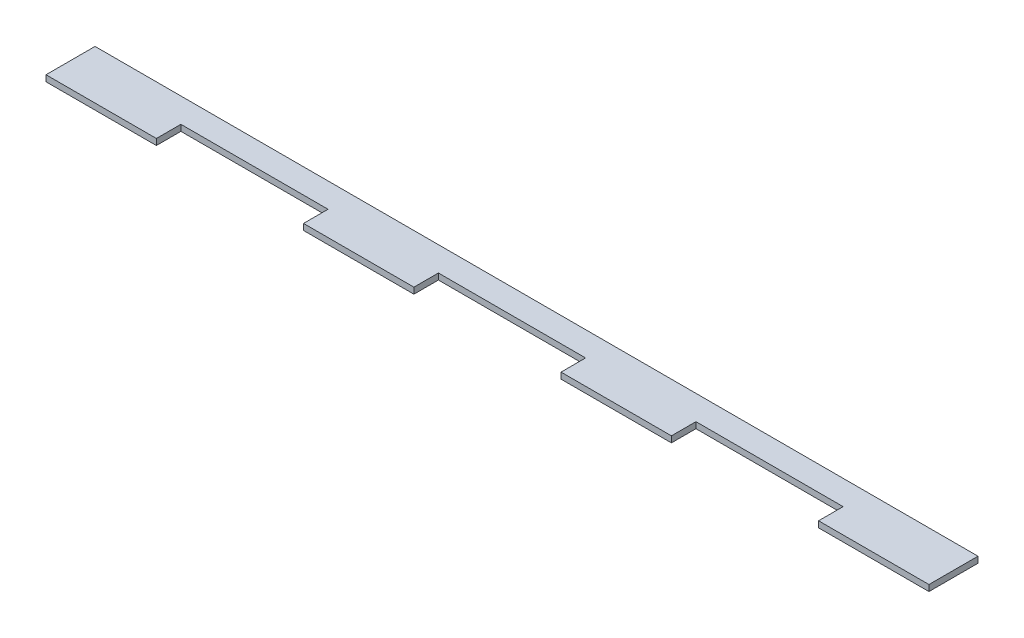
ISO-10303-21;
HEADER;
FILE_DESCRIPTION(('STEP AP214'),'2;1');
FILE_NAME('part.step','',(''),(''),'','','');
FILE_SCHEMA(('AUTOMOTIVE_DESIGN { 1 0 10303 214 1 1 1 1 }'));
ENDSEC;
DATA;
#1=APPLICATION_CONTEXT('core data for automotive mechanical design processes');
#2=APPLICATION_PROTOCOL_DEFINITION('international standard','automotive_design',2000,#1);
#3=PRODUCT_CONTEXT('',#1,'mechanical');
#4=PRODUCT('Part','Part','',(#3));
#5=PRODUCT_RELATED_PRODUCT_CATEGORY('part','',(#4));
#6=PRODUCT_DEFINITION_FORMATION('','',#4);
#7=PRODUCT_DEFINITION_CONTEXT('part definition',#1,'design');
#8=PRODUCT_DEFINITION('design','',#6,#7);
#9=PRODUCT_DEFINITION_SHAPE('','',#8);
#10=(LENGTH_UNIT() NAMED_UNIT(*) SI_UNIT(.MILLI.,.METRE.));
#11=(NAMED_UNIT(*) PLANE_ANGLE_UNIT() SI_UNIT($,.RADIAN.));
#12=(NAMED_UNIT(*) SI_UNIT($,.STERADIAN.) SOLID_ANGLE_UNIT());
#13=UNCERTAINTY_MEASURE_WITH_UNIT(LENGTH_MEASURE(1.E-05),#10,'distance_accuracy_value','');
#14=(GEOMETRIC_REPRESENTATION_CONTEXT(3) GLOBAL_UNCERTAINTY_ASSIGNED_CONTEXT((#13)) GLOBAL_UNIT_ASSIGNED_CONTEXT((#10,
#11,#12)) REPRESENTATION_CONTEXT('',''));
#15=CARTESIAN_POINT('',(0.,0.,0.));
#16=DIRECTION('',(0.,0.,1.));
#17=DIRECTION('',(1.,0.,0.));
#18=AXIS2_PLACEMENT_3D('',#15,#16,#17);
#19=CARTESIAN_POINT('',(-39.5347936844725,12.7,33.6916009072077));
#20=DIRECTION('',(0.,0.,-1.));
#21=DIRECTION('',(-1.,0.,0.));
#22=AXIS2_PLACEMENT_3D('',#19,#20,#21);
#23=PLANE('',#22);
#24=DIRECTION('',(1.,0.,0.));
#25=VECTOR('',#24,1.);
#26=CARTESIAN_POINT('',(-39.5347936844725,0.,33.6916009072077));
#27=LINE('',#26,#25);
#28=CARTESIAN_POINT('',(-39.5347936844725,0.,33.6916009072077));
#29=VERTEX_POINT('',#28);
#30=CARTESIAN_POINT('',(189.065206315528,0.,33.6916009072077));
#31=VERTEX_POINT('',#30);
#32=EDGE_CURVE('E173',#29,#31,#27,.T.);
#33=ORIENTED_EDGE('',*,*,#32,.T.);
#34=DIRECTION('',(0.,1.,0.));
#35=VECTOR('',#34,1.);
#36=CARTESIAN_POINT('',(189.065206315528,0.,33.6916009072077));
#37=LINE('',#36,#35);
#38=CARTESIAN_POINT('',(189.065206315528,12.7,33.6916009072077));
#39=VERTEX_POINT('',#38);
#40=EDGE_CURVE('E292',#31,#39,#37,.T.);
#41=ORIENTED_EDGE('',*,*,#40,.T.);
#42=DIRECTION('',(1.,0.,0.));
#43=VECTOR('',#42,1.);
#44=CARTESIAN_POINT('',(-39.5347936844725,12.7,33.6916009072077));
#45=LINE('',#44,#43);
#46=CARTESIAN_POINT('',(-39.5347936844725,12.7,33.6916009072077));
#47=VERTEX_POINT('',#46);
#48=EDGE_CURVE('E223',#47,#39,#45,.T.);
#49=ORIENTED_EDGE('',*,*,#48,.F.);
#50=DIRECTION('',(0.,-1.,0.));
#51=VECTOR('',#50,1.);
#52=CARTESIAN_POINT('',(-39.5347936844725,12.7,33.6916009072077));
#53=LINE('',#52,#51);
#54=EDGE_CURVE('E11',#47,#29,#53,.T.);
#55=ORIENTED_EDGE('',*,*,#54,.T.);
#56=EDGE_LOOP('',(#33,#41,#49,#55));
#57=FACE_BOUND('',#56,.T.);
#58=ADVANCED_FACE('F35',(#57),#23,.F.);
#59=CARTESIAN_POINT('',(1027.26520631553,0.,33.6916009072077));
#60=VERTEX_POINT('',#59);
#61=CARTESIAN_POINT('',(1255.86520631553,0.,33.6916009072077));
#62=VERTEX_POINT('',#61);
#63=EDGE_CURVE('E174',#60,#62,#27,.T.);
#64=ORIENTED_EDGE('',*,*,#63,.T.);
#65=DIRECTION('',(0.,1.,0.));
#66=VECTOR('',#65,1.);
#67=CARTESIAN_POINT('',(1255.86520631553,0.,33.6916009072077));
#68=LINE('',#67,#66);
#69=CARTESIAN_POINT('',(1255.86520631553,12.7,33.6916009072077));
#70=VERTEX_POINT('',#69);
#71=EDGE_CURVE('E280',#62,#70,#68,.T.);
#72=ORIENTED_EDGE('',*,*,#71,.T.);
#73=CARTESIAN_POINT('',(1027.26520631553,12.7,33.6916009072077));
#74=VERTEX_POINT('',#73);
#75=EDGE_CURVE('E221',#74,#70,#45,.T.);
#76=ORIENTED_EDGE('',*,*,#75,.F.);
#77=DIRECTION('',(0.,1.,0.));
#78=VECTOR('',#77,1.);
#79=CARTESIAN_POINT('',(1027.26520631553,0.,33.6916009072077));
#80=LINE('',#79,#78);
#81=EDGE_CURVE('E225',#60,#74,#80,.T.);
#82=ORIENTED_EDGE('',*,*,#81,.F.);
#83=EDGE_LOOP('',(#64,#72,#76,#82));
#84=FACE_BOUND('',#83,.T.);
#85=ADVANCED_FACE('F279',(#84),#23,.F.);
#86=CARTESIAN_POINT('',(493.865206315527,12.7,33.6916009072077));
#87=VERTEX_POINT('',#86);
#88=CARTESIAN_POINT('',(722.465206315528,12.7,33.6916009072077));
#89=VERTEX_POINT('',#88);
#90=EDGE_CURVE('E165',#87,#89,#45,.T.);
#91=ORIENTED_EDGE('',*,*,#90,.F.);
#92=DIRECTION('',(0.,1.,0.));
#93=VECTOR('',#92,1.);
#94=CARTESIAN_POINT('',(493.865206315527,0.,33.6916009072077));
#95=LINE('',#94,#93);
#96=CARTESIAN_POINT('',(493.865206315527,0.,33.6916009072077));
#97=VERTEX_POINT('',#96);
#98=EDGE_CURVE('E151',#97,#87,#95,.T.);
#99=ORIENTED_EDGE('',*,*,#98,.F.);
#100=CARTESIAN_POINT('',(722.465206315528,0.,33.6916009072077));
#101=VERTEX_POINT('',#100);
#102=EDGE_CURVE('E163',#97,#101,#27,.T.);
#103=ORIENTED_EDGE('',*,*,#102,.T.);
#104=DIRECTION('',(0.,1.,0.));
#105=VECTOR('',#104,1.);
#106=CARTESIAN_POINT('',(722.465206315528,0.,33.6916009072077));
#107=LINE('',#106,#105);
#108=EDGE_CURVE('E261',#101,#89,#107,.T.);
#109=ORIENTED_EDGE('',*,*,#108,.T.);
#110=EDGE_LOOP('',(#91,#99,#103,#109));
#111=FACE_BOUND('',#110,.T.);
#112=ADVANCED_FACE('F161',(#111),#23,.F.);
#113=CARTESIAN_POINT('',(-39.5347936844725,12.7,-67.9083990927923));
#114=DIRECTION('',(1.,0.,0.));
#115=DIRECTION('',(0.,0.,-1.));
#116=AXIS2_PLACEMENT_3D('',#113,#114,#115);
#117=PLANE('',#116);
#118=DIRECTION('',(0.,0.,1.));
#119=VECTOR('',#118,1.);
#120=CARTESIAN_POINT('',(-39.5347936844725,0.,-67.9083990927923));
#121=LINE('',#120,#119);
#122=CARTESIAN_POINT('',(-39.5347936844725,0.,-67.9083990927923));
#123=VERTEX_POINT('',#122);
#124=EDGE_CURVE('E182',#123,#29,#121,.T.);
#125=ORIENTED_EDGE('',*,*,#124,.T.);
#126=ORIENTED_EDGE('',*,*,#54,.F.);
#127=DIRECTION('',(0.,0.,1.));
#128=VECTOR('',#127,1.);
#129=CARTESIAN_POINT('',(-39.5347936844725,12.7,-67.9083990927923));
#130=LINE('',#129,#128);
#131=CARTESIAN_POINT('',(-39.5347936844725,12.7,-67.9083990927923));
#132=VERTEX_POINT('',#131);
#133=EDGE_CURVE('E187',#132,#47,#130,.T.);
#134=ORIENTED_EDGE('',*,*,#133,.F.);
#135=DIRECTION('',(0.,-1.,0.));
#136=VECTOR('',#135,1.);
#137=CARTESIAN_POINT('',(-39.5347936844725,12.7,-67.9083990927923));
#138=LINE('',#137,#136);
#139=EDGE_CURVE('E188',#132,#123,#138,.T.);
#140=ORIENTED_EDGE('',*,*,#139,.T.);
#141=EDGE_LOOP('',(#125,#126,#134,#140));
#142=FACE_BOUND('',#141,.T.);
#143=ADVANCED_FACE('F37',(#142),#117,.F.);
#144=CARTESIAN_POINT('',(1560.66520631553,12.7,33.6916009072077));
#145=VERTEX_POINT('',#144);
#146=CARTESIAN_POINT('',(1789.26520631553,12.7,33.6916009072077));
#147=VERTEX_POINT('',#146);
#148=EDGE_CURVE('E219',#145,#147,#45,.T.);
#149=ORIENTED_EDGE('',*,*,#148,.F.);
#150=DIRECTION('',(0.,1.,0.));
#151=VECTOR('',#150,1.);
#152=CARTESIAN_POINT('',(1560.66520631553,0.,33.6916009072077));
#153=LINE('',#152,#151);
#154=CARTESIAN_POINT('',(1560.66520631553,0.,33.6916009072077));
#155=VERTEX_POINT('',#154);
#156=EDGE_CURVE('E236',#155,#145,#153,.T.);
#157=ORIENTED_EDGE('',*,*,#156,.F.);
#158=CARTESIAN_POINT('',(1789.26520631553,0.,33.6916009072077));
#159=VERTEX_POINT('',#158);
#160=EDGE_CURVE('E178',#155,#159,#27,.T.);
#161=ORIENTED_EDGE('',*,*,#160,.T.);
#162=DIRECTION('',(0.,-1.,0.));
#163=VECTOR('',#162,1.);
#164=CARTESIAN_POINT('',(1789.26520631553,12.7,33.6916009072077));
#165=LINE('',#164,#163);
#166=EDGE_CURVE('E43',#147,#159,#165,.T.);
#167=ORIENTED_EDGE('',*,*,#166,.F.);
#168=EDGE_LOOP('',(#149,#157,#161,#167));
#169=FACE_BOUND('',#168,.T.);
#170=ADVANCED_FACE('F235',(#169),#23,.F.);
#171=CARTESIAN_POINT('',(1789.26520631553,12.7,-67.9083990927923));
#172=DIRECTION('',(-1.,0.,0.));
#173=DIRECTION('',(0.,0.,1.));
#174=AXIS2_PLACEMENT_3D('',#171,#172,#173);
#175=PLANE('',#174);
#176=DIRECTION('',(0.,0.,-1.));
#177=VECTOR('',#176,1.);
#178=CARTESIAN_POINT('',(1789.26520631553,0.,-67.9083990927923));
#179=LINE('',#178,#177);
#180=CARTESIAN_POINT('',(1789.26520631553,0.,-67.9083990927923));
#181=VERTEX_POINT('',#180);
#182=EDGE_CURVE('E177',#159,#181,#179,.T.);
#183=ORIENTED_EDGE('',*,*,#182,.T.);
#184=DIRECTION('',(0.,-1.,0.));
#185=VECTOR('',#184,1.);
#186=CARTESIAN_POINT('',(1789.26520631553,12.7,-67.9083990927923));
#187=LINE('',#186,#185);
#188=CARTESIAN_POINT('',(1789.26520631553,12.7,-67.9083990927923));
#189=VERTEX_POINT('',#188);
#190=EDGE_CURVE('E191',#189,#181,#187,.T.);
#191=ORIENTED_EDGE('',*,*,#190,.F.);
#192=DIRECTION('',(0.,0.,-1.));
#193=VECTOR('',#192,1.);
#194=CARTESIAN_POINT('',(1789.26520631553,12.7,-67.9083990927923));
#195=LINE('',#194,#193);
#196=EDGE_CURVE('E201',#147,#189,#195,.T.);
#197=ORIENTED_EDGE('',*,*,#196,.F.);
#198=ORIENTED_EDGE('',*,*,#166,.T.);
#199=EDGE_LOOP('',(#183,#191,#197,#198));
#200=FACE_BOUND('',#199,.T.);
#201=ADVANCED_FACE('F199',(#200),#175,.F.);
#202=CARTESIAN_POINT('',(-39.5347936844725,12.7,-67.9083990927923));
#203=DIRECTION('',(0.,0.,1.));
#204=DIRECTION('',(1.,0.,0.));
#205=AXIS2_PLACEMENT_3D('',#202,#203,#204);
#206=PLANE('',#205);
#207=DIRECTION('',(-1.,0.,0.));
#208=VECTOR('',#207,1.);
#209=CARTESIAN_POINT('',(-39.5347936844725,0.,-67.9083990927923));
#210=LINE('',#209,#208);
#211=EDGE_CURVE('E185',#181,#123,#210,.T.);
#212=ORIENTED_EDGE('',*,*,#211,.T.);
#213=ORIENTED_EDGE('',*,*,#139,.F.);
#214=DIRECTION('',(-1.,0.,0.));
#215=VECTOR('',#214,1.);
#216=CARTESIAN_POINT('',(-39.5347936844725,12.7,-67.9083990927923));
#217=LINE('',#216,#215);
#218=EDGE_CURVE('E192',#189,#132,#217,.T.);
#219=ORIENTED_EDGE('',*,*,#218,.F.);
#220=ORIENTED_EDGE('',*,*,#190,.T.);
#221=EDGE_LOOP('',(#212,#213,#219,#220));
#222=FACE_BOUND('',#221,.T.);
#223=ADVANCED_FACE('F211',(#222),#206,.F.);
#224=CARTESIAN_POINT('',(0.,12.7,0.));
#225=DIRECTION('',(0.,1.,0.));
#226=DIRECTION('',(0.,0.,1.));
#227=AXIS2_PLACEMENT_3D('',#224,#225,#226);
#228=PLANE('',#227);
#229=DIRECTION('',(0.,0.,1.));
#230=VECTOR('',#229,1.);
#231=CARTESIAN_POINT('',(189.065206315528,12.7,33.6916009072077));
#232=LINE('',#231,#230);
#233=CARTESIAN_POINT('',(189.065206315528,12.7,-17.1083990927923));
#234=VERTEX_POINT('',#233);
#235=EDGE_CURVE('E156',#234,#39,#232,.T.);
#236=ORIENTED_EDGE('',*,*,#235,.F.);
#237=DIRECTION('',(-1.,0.,0.));
#238=VECTOR('',#237,1.);
#239=CARTESIAN_POINT('',(189.065206315528,12.7,-17.1083990927923));
#240=LINE('',#239,#238);
#241=CARTESIAN_POINT('',(493.865206315527,12.7,-17.1083990927923));
#242=VERTEX_POINT('',#241);
#243=EDGE_CURVE('E284',#242,#234,#240,.T.);
#244=ORIENTED_EDGE('',*,*,#243,.F.);
#245=DIRECTION('',(0.,0.,-1.));
#246=VECTOR('',#245,1.);
#247=CARTESIAN_POINT('',(493.865206315527,12.7,-17.1083990927923));
#248=LINE('',#247,#246);
#249=EDGE_CURVE('E282',#87,#242,#248,.T.);
#250=ORIENTED_EDGE('',*,*,#249,.F.);
#251=ORIENTED_EDGE('',*,*,#90,.T.);
#252=DIRECTION('',(0.,0.,1.));
#253=VECTOR('',#252,1.);
#254=CARTESIAN_POINT('',(722.465206315528,12.7,33.6916009072077));
#255=LINE('',#254,#253);
#256=CARTESIAN_POINT('',(722.465206315528,12.7,-17.1083990927923));
#257=VERTEX_POINT('',#256);
#258=EDGE_CURVE('E251',#257,#89,#255,.T.);
#259=ORIENTED_EDGE('',*,*,#258,.F.);
#260=DIRECTION('',(-1.,0.,0.));
#261=VECTOR('',#260,1.);
#262=CARTESIAN_POINT('',(722.465206315528,12.7,-17.1083990927923));
#263=LINE('',#262,#261);
#264=CARTESIAN_POINT('',(1027.26520631553,12.7,-17.1083990927923));
#265=VERTEX_POINT('',#264);
#266=EDGE_CURVE('E257',#265,#257,#263,.T.);
#267=ORIENTED_EDGE('',*,*,#266,.F.);
#268=DIRECTION('',(0.,0.,-1.));
#269=VECTOR('',#268,1.);
#270=CARTESIAN_POINT('',(1027.26520631553,12.7,-17.1083990927923));
#271=LINE('',#270,#269);
#272=EDGE_CURVE('E254',#74,#265,#271,.T.);
#273=ORIENTED_EDGE('',*,*,#272,.F.);
#274=ORIENTED_EDGE('',*,*,#75,.T.);
#275=DIRECTION('',(0.,0.,1.));
#276=VECTOR('',#275,1.);
#277=CARTESIAN_POINT('',(1255.86520631553,12.7,33.6916009072077));
#278=LINE('',#277,#276);
#279=CARTESIAN_POINT('',(1255.86520631553,12.7,-17.1083990927923));
#280=VERTEX_POINT('',#279);
#281=EDGE_CURVE('E300',#280,#70,#278,.T.);
#282=ORIENTED_EDGE('',*,*,#281,.F.);
#283=DIRECTION('',(-1.,0.,0.));
#284=VECTOR('',#283,1.);
#285=CARTESIAN_POINT('',(1255.86520631553,12.7,-17.1083990927923));
#286=LINE('',#285,#284);
#287=CARTESIAN_POINT('',(1560.66520631553,12.7,-17.1083990927923));
#288=VERTEX_POINT('',#287);
#289=EDGE_CURVE('E303',#288,#280,#286,.T.);
#290=ORIENTED_EDGE('',*,*,#289,.F.);
#291=DIRECTION('',(0.,0.,-1.));
#292=VECTOR('',#291,1.);
#293=CARTESIAN_POINT('',(1560.66520631553,12.7,-17.1083990927923));
#294=LINE('',#293,#292);
#295=EDGE_CURVE('E233',#145,#288,#294,.T.);
#296=ORIENTED_EDGE('',*,*,#295,.F.);
#297=ORIENTED_EDGE('',*,*,#148,.T.);
#298=ORIENTED_EDGE('',*,*,#196,.T.);
#299=ORIENTED_EDGE('',*,*,#218,.T.);
#300=ORIENTED_EDGE('',*,*,#133,.T.);
#301=ORIENTED_EDGE('',*,*,#48,.T.);
#302=EDGE_LOOP('',(#236,#244,#250,#251,#259,#267,#273,#274,#282,#290,#296,#297,#298,#299,#300,#301));
#303=FACE_BOUND('',#302,.T.);
#304=ADVANCED_FACE('F229',(#303),#228,.T.);
#305=CARTESIAN_POINT('',(0.,0.,0.));
#306=DIRECTION('',(0.,1.,0.));
#307=DIRECTION('',(0.,0.,1.));
#308=AXIS2_PLACEMENT_3D('',#305,#306,#307);
#309=PLANE('',#308);
#310=DIRECTION('',(-1.,0.,0.));
#311=VECTOR('',#310,1.);
#312=CARTESIAN_POINT('',(189.065206315528,0.,-17.1083990927923));
#313=LINE('',#312,#311);
#314=CARTESIAN_POINT('',(493.865206315527,0.,-17.1083990927923));
#315=VERTEX_POINT('',#314);
#316=CARTESIAN_POINT('',(189.065206315528,0.,-17.1083990927923));
#317=VERTEX_POINT('',#316);
#318=EDGE_CURVE('E50',#315,#317,#313,.T.);
#319=ORIENTED_EDGE('',*,*,#318,.T.);
#320=DIRECTION('',(0.,0.,1.));
#321=VECTOR('',#320,1.);
#322=CARTESIAN_POINT('',(189.065206315528,0.,33.6916009072077));
#323=LINE('',#322,#321);
#324=EDGE_CURVE('E166',#317,#31,#323,.T.);
#325=ORIENTED_EDGE('',*,*,#324,.T.);
#326=ORIENTED_EDGE('',*,*,#32,.F.);
#327=ORIENTED_EDGE('',*,*,#124,.F.);
#328=ORIENTED_EDGE('',*,*,#211,.F.);
#329=ORIENTED_EDGE('',*,*,#182,.F.);
#330=ORIENTED_EDGE('',*,*,#160,.F.);
#331=DIRECTION('',(0.,0.,-1.));
#332=VECTOR('',#331,1.);
#333=CARTESIAN_POINT('',(1560.66520631553,0.,-17.1083990927923));
#334=LINE('',#333,#332);
#335=CARTESIAN_POINT('',(1560.66520631553,0.,-17.1083990927923));
#336=VERTEX_POINT('',#335);
#337=EDGE_CURVE('E298',#155,#336,#334,.T.);
#338=ORIENTED_EDGE('',*,*,#337,.T.);
#339=DIRECTION('',(-1.,0.,0.));
#340=VECTOR('',#339,1.);
#341=CARTESIAN_POINT('',(1255.86520631553,0.,-17.1083990927923));
#342=LINE('',#341,#340);
#343=CARTESIAN_POINT('',(1255.86520631553,0.,-17.1083990927923));
#344=VERTEX_POINT('',#343);
#345=EDGE_CURVE('E58',#336,#344,#342,.T.);
#346=ORIENTED_EDGE('',*,*,#345,.T.);
#347=DIRECTION('',(0.,0.,1.));
#348=VECTOR('',#347,1.);
#349=CARTESIAN_POINT('',(1255.86520631553,0.,33.6916009072077));
#350=LINE('',#349,#348);
#351=EDGE_CURVE('E239',#344,#62,#350,.T.);
#352=ORIENTED_EDGE('',*,*,#351,.T.);
#353=ORIENTED_EDGE('',*,*,#63,.F.);
#354=DIRECTION('',(0.,0.,-1.));
#355=VECTOR('',#354,1.);
#356=CARTESIAN_POINT('',(1027.26520631553,0.,-17.1083990927923));
#357=LINE('',#356,#355);
#358=CARTESIAN_POINT('',(1027.26520631553,0.,-17.1083990927923));
#359=VERTEX_POINT('',#358);
#360=EDGE_CURVE('E247',#60,#359,#357,.T.);
#361=ORIENTED_EDGE('',*,*,#360,.T.);
#362=DIRECTION('',(-1.,0.,0.));
#363=VECTOR('',#362,1.);
#364=CARTESIAN_POINT('',(722.465206315528,0.,-17.1083990927923));
#365=LINE('',#364,#363);
#366=CARTESIAN_POINT('',(722.465206315528,0.,-17.1083990927923));
#367=VERTEX_POINT('',#366);
#368=EDGE_CURVE('E250',#359,#367,#365,.T.);
#369=ORIENTED_EDGE('',*,*,#368,.T.);
#370=DIRECTION('',(0.,0.,1.));
#371=VECTOR('',#370,1.);
#372=CARTESIAN_POINT('',(722.465206315528,0.,33.6916009072077));
#373=LINE('',#372,#371);
#374=EDGE_CURVE('E172',#367,#101,#373,.T.);
#375=ORIENTED_EDGE('',*,*,#374,.T.);
#376=ORIENTED_EDGE('',*,*,#102,.F.);
#377=DIRECTION('',(0.,0.,-1.));
#378=VECTOR('',#377,1.);
#379=CARTESIAN_POINT('',(493.865206315527,0.,-17.1083990927923));
#380=LINE('',#379,#378);
#381=EDGE_CURVE('E147',#97,#315,#380,.T.);
#382=ORIENTED_EDGE('',*,*,#381,.T.);
#383=EDGE_LOOP('',(#319,#325,#326,#327,#328,#329,#330,#338,#346,#352,#353,#361,#369,#375,#376,#382));
#384=FACE_BOUND('',#383,.T.);
#385=ADVANCED_FACE('F169',(#384),#309,.F.);
#386=CARTESIAN_POINT('',(722.465206315528,0.,33.6916009072077));
#387=DIRECTION('',(-1.,0.,0.));
#388=DIRECTION('',(0.,0.,1.));
#389=AXIS2_PLACEMENT_3D('',#386,#387,#388);
#390=PLANE('',#389);
#391=ORIENTED_EDGE('',*,*,#258,.T.);
#392=ORIENTED_EDGE('',*,*,#108,.F.);
#393=ORIENTED_EDGE('',*,*,#374,.F.);
#394=DIRECTION('',(0.,1.,0.));
#395=VECTOR('',#394,1.);
#396=CARTESIAN_POINT('',(722.465206315528,0.,-17.1083990927923));
#397=LINE('',#396,#395);
#398=EDGE_CURVE('E263',#367,#257,#397,.T.);
#399=ORIENTED_EDGE('',*,*,#398,.T.);
#400=EDGE_LOOP('',(#391,#392,#393,#399));
#401=FACE_BOUND('',#400,.T.);
#402=ADVANCED_FACE('F380',(#401),#390,.F.);
#403=CARTESIAN_POINT('',(722.465206315528,0.,-17.1083990927923));
#404=DIRECTION('',(0.,0.,-1.));
#405=DIRECTION('',(-1.,0.,0.));
#406=AXIS2_PLACEMENT_3D('',#403,#404,#405);
#407=PLANE('',#406);
#408=ORIENTED_EDGE('',*,*,#266,.T.);
#409=ORIENTED_EDGE('',*,*,#398,.F.);
#410=ORIENTED_EDGE('',*,*,#368,.F.);
#411=DIRECTION('',(0.,1.,0.));
#412=VECTOR('',#411,1.);
#413=CARTESIAN_POINT('',(1027.26520631553,0.,-17.1083990927923));
#414=LINE('',#413,#412);
#415=EDGE_CURVE('E264',#359,#265,#414,.T.);
#416=ORIENTED_EDGE('',*,*,#415,.T.);
#417=EDGE_LOOP('',(#408,#409,#410,#416));
#418=FACE_BOUND('',#417,.T.);
#419=ADVANCED_FACE('F397',(#418),#407,.F.);
#420=CARTESIAN_POINT('',(1027.26520631553,0.,-17.1083990927923));
#421=DIRECTION('',(1.,0.,0.));
#422=DIRECTION('',(0.,0.,-1.));
#423=AXIS2_PLACEMENT_3D('',#420,#421,#422);
#424=PLANE('',#423);
#425=ORIENTED_EDGE('',*,*,#272,.T.);
#426=ORIENTED_EDGE('',*,*,#415,.F.);
#427=ORIENTED_EDGE('',*,*,#360,.F.);
#428=ORIENTED_EDGE('',*,*,#81,.T.);
#429=EDGE_LOOP('',(#425,#426,#427,#428));
#430=FACE_BOUND('',#429,.T.);
#431=ADVANCED_FACE('F270',(#430),#424,.F.);
#432=CARTESIAN_POINT('',(1255.86520631553,0.,33.6916009072077));
#433=DIRECTION('',(-1.,0.,0.));
#434=DIRECTION('',(0.,0.,1.));
#435=AXIS2_PLACEMENT_3D('',#432,#433,#434);
#436=PLANE('',#435);
#437=ORIENTED_EDGE('',*,*,#281,.T.);
#438=ORIENTED_EDGE('',*,*,#71,.F.);
#439=ORIENTED_EDGE('',*,*,#351,.F.);
#440=DIRECTION('',(0.,1.,0.));
#441=VECTOR('',#440,1.);
#442=CARTESIAN_POINT('',(1255.86520631553,0.,-17.1083990927923));
#443=LINE('',#442,#441);
#444=EDGE_CURVE('E241',#344,#280,#443,.T.);
#445=ORIENTED_EDGE('',*,*,#444,.T.);
#446=EDGE_LOOP('',(#437,#438,#439,#445));
#447=FACE_BOUND('',#446,.T.);
#448=ADVANCED_FACE('F308',(#447),#436,.F.);
#449=CARTESIAN_POINT('',(1255.86520631553,0.,-17.1083990927923));
#450=DIRECTION('',(0.,0.,-1.));
#451=DIRECTION('',(-1.,0.,0.));
#452=AXIS2_PLACEMENT_3D('',#449,#450,#451);
#453=PLANE('',#452);
#454=ORIENTED_EDGE('',*,*,#289,.T.);
#455=ORIENTED_EDGE('',*,*,#444,.F.);
#456=ORIENTED_EDGE('',*,*,#345,.F.);
#457=DIRECTION('',(0.,1.,0.));
#458=VECTOR('',#457,1.);
#459=CARTESIAN_POINT('',(1560.66520631553,0.,-17.1083990927923));
#460=LINE('',#459,#458);
#461=EDGE_CURVE('E238',#336,#288,#460,.T.);
#462=ORIENTED_EDGE('',*,*,#461,.T.);
#463=EDGE_LOOP('',(#454,#455,#456,#462));
#464=FACE_BOUND('',#463,.T.);
#465=ADVANCED_FACE('F309',(#464),#453,.F.);
#466=CARTESIAN_POINT('',(1560.66520631553,0.,-17.1083990927923));
#467=DIRECTION('',(1.,0.,0.));
#468=DIRECTION('',(0.,0.,-1.));
#469=AXIS2_PLACEMENT_3D('',#466,#467,#468);
#470=PLANE('',#469);
#471=ORIENTED_EDGE('',*,*,#295,.T.);
#472=ORIENTED_EDGE('',*,*,#461,.F.);
#473=ORIENTED_EDGE('',*,*,#337,.F.);
#474=ORIENTED_EDGE('',*,*,#156,.T.);
#475=EDGE_LOOP('',(#471,#472,#473,#474));
#476=FACE_BOUND('',#475,.T.);
#477=ADVANCED_FACE('F310',(#476),#470,.F.);
#478=CARTESIAN_POINT('',(189.065206315528,0.,33.6916009072077));
#479=DIRECTION('',(-1.,0.,0.));
#480=DIRECTION('',(0.,0.,1.));
#481=AXIS2_PLACEMENT_3D('',#478,#479,#480);
#482=PLANE('',#481);
#483=ORIENTED_EDGE('',*,*,#235,.T.);
#484=ORIENTED_EDGE('',*,*,#40,.F.);
#485=ORIENTED_EDGE('',*,*,#324,.F.);
#486=DIRECTION('',(0.,1.,0.));
#487=VECTOR('',#486,1.);
#488=CARTESIAN_POINT('',(189.065206315528,0.,-17.1083990927923));
#489=LINE('',#488,#487);
#490=EDGE_CURVE('E295',#317,#234,#489,.T.);
#491=ORIENTED_EDGE('',*,*,#490,.T.);
#492=EDGE_LOOP('',(#483,#484,#485,#491));
#493=FACE_BOUND('',#492,.T.);
#494=ADVANCED_FACE('F312',(#493),#482,.F.);
#495=CARTESIAN_POINT('',(189.065206315528,0.,-17.1083990927923));
#496=DIRECTION('',(0.,0.,-1.));
#497=DIRECTION('',(-1.,0.,0.));
#498=AXIS2_PLACEMENT_3D('',#495,#496,#497);
#499=PLANE('',#498);
#500=ORIENTED_EDGE('',*,*,#243,.T.);
#501=ORIENTED_EDGE('',*,*,#490,.F.);
#502=ORIENTED_EDGE('',*,*,#318,.F.);
#503=DIRECTION('',(0.,1.,0.));
#504=VECTOR('',#503,1.);
#505=CARTESIAN_POINT('',(493.865206315527,0.,-17.1083990927923));
#506=LINE('',#505,#504);
#507=EDGE_CURVE('E153',#315,#242,#506,.T.);
#508=ORIENTED_EDGE('',*,*,#507,.T.);
#509=EDGE_LOOP('',(#500,#501,#502,#508));
#510=FACE_BOUND('',#509,.T.);
#511=ADVANCED_FACE('F318',(#510),#499,.F.);
#512=CARTESIAN_POINT('',(493.865206315527,0.,-17.1083990927923));
#513=DIRECTION('',(1.,0.,0.));
#514=DIRECTION('',(0.,0.,-1.));
#515=AXIS2_PLACEMENT_3D('',#512,#513,#514);
#516=PLANE('',#515);
#517=ORIENTED_EDGE('',*,*,#249,.T.);
#518=ORIENTED_EDGE('',*,*,#507,.F.);
#519=ORIENTED_EDGE('',*,*,#381,.F.);
#520=ORIENTED_EDGE('',*,*,#98,.T.);
#521=EDGE_LOOP('',(#517,#518,#519,#520));
#522=FACE_BOUND('',#521,.T.);
#523=ADVANCED_FACE('F150',(#522),#516,.F.);
#524=CLOSED_SHELL('',(#58,#85,#112,#143,#170,#201,#223,#304,#385,#402,#419,#431,#448,#465,#477,
#494,#511,#523));
#525=MANIFOLD_SOLID_BREP('B2',#524);
#526=ADVANCED_BREP_SHAPE_REPRESENTATION('',(#18,#525),#14);
#527=SHAPE_DEFINITION_REPRESENTATION(#9,#526);
ENDSEC;
END-ISO-10303-21;
